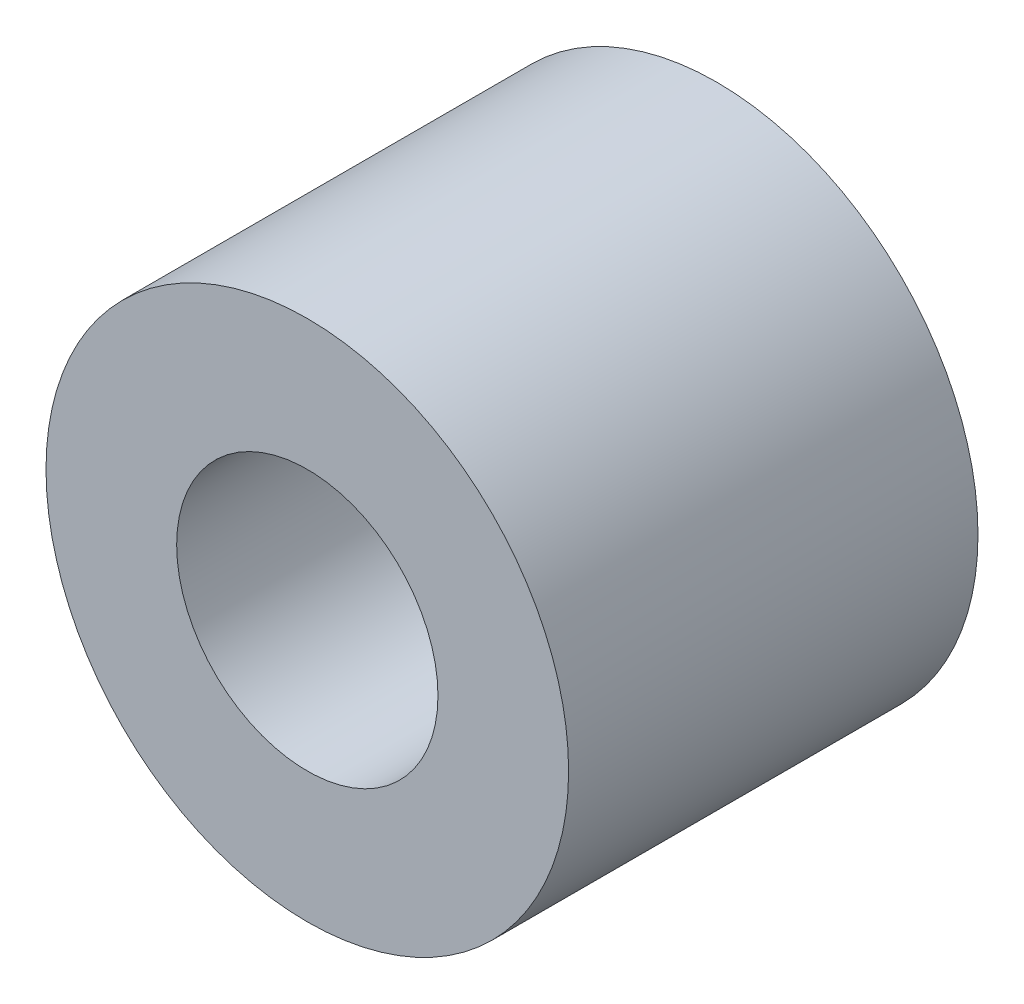
ISO-10303-21;
HEADER;
FILE_DESCRIPTION(('STEP AP214'),'2;1');
FILE_NAME('part.step','',(''),(''),'','','');
FILE_SCHEMA(('AUTOMOTIVE_DESIGN { 1 0 10303 214 1 1 1 1 }'));
ENDSEC;
DATA;
#1=APPLICATION_CONTEXT('core data for automotive mechanical design processes');
#2=APPLICATION_PROTOCOL_DEFINITION('international standard','automotive_design',2000,#1);
#3=PRODUCT_CONTEXT('',#1,'mechanical');
#4=PRODUCT('Part','Part','',(#3));
#5=PRODUCT_RELATED_PRODUCT_CATEGORY('part','',(#4));
#6=PRODUCT_DEFINITION_FORMATION('','',#4);
#7=PRODUCT_DEFINITION_CONTEXT('part definition',#1,'design');
#8=PRODUCT_DEFINITION('design','',#6,#7);
#9=PRODUCT_DEFINITION_SHAPE('','',#8);
#10=(LENGTH_UNIT() NAMED_UNIT(*) SI_UNIT(.MILLI.,.METRE.));
#11=(NAMED_UNIT(*) PLANE_ANGLE_UNIT() SI_UNIT($,.RADIAN.));
#12=(NAMED_UNIT(*) SI_UNIT($,.STERADIAN.) SOLID_ANGLE_UNIT());
#13=UNCERTAINTY_MEASURE_WITH_UNIT(LENGTH_MEASURE(1.E-05),#10,'distance_accuracy_value','');
#14=(GEOMETRIC_REPRESENTATION_CONTEXT(3) GLOBAL_UNCERTAINTY_ASSIGNED_CONTEXT((#13)) GLOBAL_UNIT_ASSIGNED_CONTEXT((#10,
#11,#12)) REPRESENTATION_CONTEXT('',''));
#15=CARTESIAN_POINT('',(0.,0.,0.));
#16=DIRECTION('',(0.,0.,1.));
#17=DIRECTION('',(1.,0.,0.));
#18=AXIS2_PLACEMENT_3D('',#15,#16,#17);
#19=CARTESIAN_POINT('',(-46.,0.,-13.1852813742386));
#20=DIRECTION('',(0.,0.,1.));
#21=DIRECTION('',(1.,0.,0.));
#22=AXIS2_PLACEMENT_3D('',#19,#20,#21);
#23=CYLINDRICAL_SURFACE('',#22,3.);
#24=CARTESIAN_POINT('',(-46.,0.,-4.7));
#25=DIRECTION('',(0.,0.,1.));
#26=DIRECTION('',(1.,0.,0.));
#27=AXIS2_PLACEMENT_3D('',#24,#25,#26);
#28=CIRCLE('',#27,3.);
#29=CARTESIAN_POINT('',(-43.,0.,-4.7));
#30=VERTEX_POINT('',#29);
#31=EDGE_CURVE('E10',#30,#30,#28,.F.);
#32=CARTESIAN_POINT('',(-46.,0.,0.));
#33=DIRECTION('',(0.,0.,1.));
#34=DIRECTION('',(1.,0.,0.));
#35=AXIS2_PLACEMENT_3D('',#32,#33,#34);
#36=CIRCLE('',#35,3.);
#37=CARTESIAN_POINT('',(-43.,0.,0.));
#38=VERTEX_POINT('',#37);
#39=EDGE_CURVE('E46',#38,#38,#36,.T.);
#40=CARTESIAN_POINT('',(-43.,0.,-4.7));
#41=CARTESIAN_POINT('',(-43.,0.,-4.65104166666667));
#42=CARTESIAN_POINT('',(-43.,0.,-4.60208333333333));
#43=CARTESIAN_POINT('',(-43.,0.,-4.50416666666667));
#44=CARTESIAN_POINT('',(-43.,0.,-4.45520833333333));
#45=CARTESIAN_POINT('',(-43.,0.,-4.35729166666667));
#46=CARTESIAN_POINT('',(-43.,0.,-4.30833333333333));
#47=CARTESIAN_POINT('',(-43.,0.,-4.21041666666667));
#48=CARTESIAN_POINT('',(-43.,0.,-4.16145833333333));
#49=CARTESIAN_POINT('',(-43.,0.,-4.06354166666667));
#50=CARTESIAN_POINT('',(-43.,0.,-4.01458333333333));
#51=CARTESIAN_POINT('',(-43.,0.,-3.91666666666667));
#52=CARTESIAN_POINT('',(-43.,0.,-3.86770833333333));
#53=CARTESIAN_POINT('',(-43.,0.,-3.76979166666667));
#54=CARTESIAN_POINT('',(-43.,0.,-3.72083333333333));
#55=CARTESIAN_POINT('',(-43.,0.,-3.62291666666667));
#56=CARTESIAN_POINT('',(-43.,0.,-3.57395833333334));
#57=CARTESIAN_POINT('',(-43.,0.,-3.47604166666667));
#58=CARTESIAN_POINT('',(-43.,0.,-3.42708333333333));
#59=CARTESIAN_POINT('',(-43.,0.,-3.32916666666667));
#60=CARTESIAN_POINT('',(-43.,0.,-3.28020833333333));
#61=CARTESIAN_POINT('',(-43.,0.,-3.18229166666667));
#62=CARTESIAN_POINT('',(-43.,0.,-3.13333333333334));
#63=CARTESIAN_POINT('',(-43.,0.,-3.03541666666667));
#64=CARTESIAN_POINT('',(-43.,0.,-2.98645833333333));
#65=CARTESIAN_POINT('',(-43.,0.,-2.88854166666667));
#66=CARTESIAN_POINT('',(-43.,0.,-2.83958333333333));
#67=CARTESIAN_POINT('',(-43.,0.,-2.74166666666667));
#68=CARTESIAN_POINT('',(-43.,0.,-2.69270833333334));
#69=CARTESIAN_POINT('',(-43.,0.,-2.59479166666667));
#70=CARTESIAN_POINT('',(-43.,0.,-2.54583333333333));
#71=CARTESIAN_POINT('',(-43.,0.,-2.44791666666667));
#72=CARTESIAN_POINT('',(-43.,0.,-2.39895833333333));
#73=CARTESIAN_POINT('',(-43.,0.,-2.30104166666667));
#74=CARTESIAN_POINT('',(-43.,0.,-2.25208333333333));
#75=CARTESIAN_POINT('',(-43.,0.,-2.15416666666667));
#76=CARTESIAN_POINT('',(-43.,0.,-2.10520833333333));
#77=CARTESIAN_POINT('',(-43.,0.,-2.00729166666667));
#78=CARTESIAN_POINT('',(-43.,0.,-1.95833333333333));
#79=CARTESIAN_POINT('',(-43.,0.,-1.86041666666667));
#80=CARTESIAN_POINT('',(-43.,0.,-1.81145833333334));
#81=CARTESIAN_POINT('',(-43.,0.,-1.71354166666667));
#82=CARTESIAN_POINT('',(-43.,0.,-1.66458333333333));
#83=CARTESIAN_POINT('',(-43.,0.,-1.56666666666667));
#84=CARTESIAN_POINT('',(-43.,0.,-1.51770833333333));
#85=CARTESIAN_POINT('',(-43.,0.,-1.41979166666667));
#86=CARTESIAN_POINT('',(-43.,0.,-1.37083333333333));
#87=CARTESIAN_POINT('',(-43.,0.,-1.27291666666667));
#88=CARTESIAN_POINT('',(-43.,0.,-1.22395833333333));
#89=CARTESIAN_POINT('',(-43.,0.,-1.12604166666667));
#90=CARTESIAN_POINT('',(-43.,0.,-1.07708333333333));
#91=CARTESIAN_POINT('',(-43.,0.,-0.979166666666668));
#92=CARTESIAN_POINT('',(-43.,0.,-0.930208333333335));
#93=CARTESIAN_POINT('',(-43.,0.,-0.832291666666668));
#94=CARTESIAN_POINT('',(-43.,0.,-0.783333333333334));
#95=CARTESIAN_POINT('',(-43.,0.,-0.685416666666667));
#96=CARTESIAN_POINT('',(-43.,0.,-0.636458333333334));
#97=CARTESIAN_POINT('',(-43.,0.,-0.538541666666668));
#98=CARTESIAN_POINT('',(-43.,0.,-0.489583333333335));
#99=CARTESIAN_POINT('',(-43.,0.,-0.391666666666668));
#100=CARTESIAN_POINT('',(-43.,0.,-0.342708333333334));
#101=CARTESIAN_POINT('',(-43.,0.,-0.244791666666668));
#102=CARTESIAN_POINT('',(-43.,0.,-0.195833333333335));
#103=CARTESIAN_POINT('',(-43.,0.,-0.0979166666666692));
#104=CARTESIAN_POINT('',(-43.,0.,-0.0489583333333355));
#105=CARTESIAN_POINT('',(-43.,0.,0.));
#106=B_SPLINE_CURVE_WITH_KNOTS('',3,(#40,#41,#42,#43,#44,#45,#46,#47,#48,#49,#50,#51,#52,#53,
#54,#55,#56,#57,#58,#59,#60,#61,#62,#63,#64,#65,#66,#67,#68,#69,#70,#71,#72,#73,#74,#75,#76,#77,
#78,#79,#80,#81,#82,#83,#84,#85,#86,#87,#88,#89,#90,#91,#92,#93,#94,#95,#96,#97,#98,#99,#100,
#101,#102,#103,#104,#105),.UNSPECIFIED.,.F.,.F.,(4,2,2,2,2,2,2,2,2,2,2,2,2,2,2,2,2,2,2,2,2,2,2,
2,2,2,2,2,2,2,2,2,4),(0.,0.146874999999999,0.293750000000001,0.440625,0.587499999999999,
0.734375000000001,0.88125,1.028125,1.175,1.321875,1.46875,1.615625,1.7625,1.909375,2.05625,
2.203125,2.35,2.496875,2.64375,2.790625,2.9375,3.084375,3.23125,3.378125,3.525,3.671875,3.81875,
3.965625,4.1125,4.259375,4.40625,4.553125,4.7),.UNSPECIFIED.);
#107=EDGE_CURVE('BSEAM35',#30,#38,#106,.T.);
#108=ORIENTED_EDGE('',*,*,#31,.F.);
#109=ORIENTED_EDGE('',*,*,#39,.F.);
#110=ORIENTED_EDGE('',*,*,#107,.T.);
#111=ORIENTED_EDGE('',*,*,#107,.F.);
#112=EDGE_LOOP('',(#108,#110,#109,#111));
#113=FACE_BOUND('',#112,.T.);
#114=ADVANCED_FACE('F35',(#113),#23,.T.);
#115=CARTESIAN_POINT('',(-46.,0.,0.));
#116=DIRECTION('',(0.,0.,1.));
#117=DIRECTION('',(1.,0.,0.));
#118=AXIS2_PLACEMENT_3D('',#115,#116,#117);
#119=PLANE('',#118);
#120=CARTESIAN_POINT('',(-46.,0.,0.));
#121=DIRECTION('',(0.,0.,1.));
#122=DIRECTION('',(1.,0.,0.));
#123=AXIS2_PLACEMENT_3D('',#120,#121,#122);
#124=CIRCLE('',#123,1.5);
#125=CARTESIAN_POINT('',(-44.5,0.,0.));
#126=VERTEX_POINT('',#125);
#127=EDGE_CURVE('E48',#126,#126,#124,.T.);
#128=ORIENTED_EDGE('',*,*,#127,.F.);
#129=EDGE_LOOP('',(#128));
#130=FACE_BOUND('',#129,.T.);
#131=ORIENTED_EDGE('',*,*,#39,.T.);
#132=EDGE_LOOP('',(#131));
#133=FACE_BOUND('',#132,.T.);
#134=ADVANCED_FACE('F53',(#130,#133),#119,.T.);
#135=CARTESIAN_POINT('',(-46.,0.,-13.1852813742386));
#136=DIRECTION('',(0.,0.,1.));
#137=DIRECTION('',(1.,0.,0.));
#138=AXIS2_PLACEMENT_3D('',#135,#136,#137);
#139=CYLINDRICAL_SURFACE('',#138,1.5);
#140=CARTESIAN_POINT('',(-46.,0.,-4.7));
#141=DIRECTION('',(0.,0.,1.));
#142=DIRECTION('',(1.,0.,0.));
#143=AXIS2_PLACEMENT_3D('',#140,#141,#142);
#144=CIRCLE('',#143,1.5);
#145=CARTESIAN_POINT('',(-44.5,0.,-4.7));
#146=VERTEX_POINT('',#145);
#147=EDGE_CURVE('E38',#146,#146,#144,.F.);
#148=CARTESIAN_POINT('',(-44.5,0.,-4.7));
#149=CARTESIAN_POINT('',(-44.5,0.,-4.65104166666667));
#150=CARTESIAN_POINT('',(-44.5,0.,-4.60208333333333));
#151=CARTESIAN_POINT('',(-44.5,0.,-4.50416666666667));
#152=CARTESIAN_POINT('',(-44.5,0.,-4.45520833333333));
#153=CARTESIAN_POINT('',(-44.5,0.,-4.35729166666667));
#154=CARTESIAN_POINT('',(-44.5,0.,-4.30833333333333));
#155=CARTESIAN_POINT('',(-44.5,0.,-4.21041666666667));
#156=CARTESIAN_POINT('',(-44.5,0.,-4.16145833333333));
#157=CARTESIAN_POINT('',(-44.5,0.,-4.06354166666667));
#158=CARTESIAN_POINT('',(-44.5,0.,-4.01458333333333));
#159=CARTESIAN_POINT('',(-44.5,0.,-3.91666666666667));
#160=CARTESIAN_POINT('',(-44.5,0.,-3.86770833333333));
#161=CARTESIAN_POINT('',(-44.5,0.,-3.76979166666667));
#162=CARTESIAN_POINT('',(-44.5,0.,-3.72083333333333));
#163=CARTESIAN_POINT('',(-44.5,0.,-3.62291666666667));
#164=CARTESIAN_POINT('',(-44.5,0.,-3.57395833333334));
#165=CARTESIAN_POINT('',(-44.5,0.,-3.47604166666667));
#166=CARTESIAN_POINT('',(-44.5,0.,-3.42708333333333));
#167=CARTESIAN_POINT('',(-44.5,0.,-3.32916666666667));
#168=CARTESIAN_POINT('',(-44.5,0.,-3.28020833333333));
#169=CARTESIAN_POINT('',(-44.5,0.,-3.18229166666667));
#170=CARTESIAN_POINT('',(-44.5,0.,-3.13333333333334));
#171=CARTESIAN_POINT('',(-44.5,0.,-3.03541666666667));
#172=CARTESIAN_POINT('',(-44.5,0.,-2.98645833333333));
#173=CARTESIAN_POINT('',(-44.5,0.,-2.88854166666667));
#174=CARTESIAN_POINT('',(-44.5,0.,-2.83958333333333));
#175=CARTESIAN_POINT('',(-44.5,0.,-2.74166666666667));
#176=CARTESIAN_POINT('',(-44.5,0.,-2.69270833333334));
#177=CARTESIAN_POINT('',(-44.5,0.,-2.59479166666667));
#178=CARTESIAN_POINT('',(-44.5,0.,-2.54583333333333));
#179=CARTESIAN_POINT('',(-44.5,0.,-2.44791666666667));
#180=CARTESIAN_POINT('',(-44.5,0.,-2.39895833333333));
#181=CARTESIAN_POINT('',(-44.5,0.,-2.30104166666667));
#182=CARTESIAN_POINT('',(-44.5,0.,-2.25208333333333));
#183=CARTESIAN_POINT('',(-44.5,0.,-2.15416666666667));
#184=CARTESIAN_POINT('',(-44.5,0.,-2.10520833333333));
#185=CARTESIAN_POINT('',(-44.5,0.,-2.00729166666667));
#186=CARTESIAN_POINT('',(-44.5,0.,-1.95833333333333));
#187=CARTESIAN_POINT('',(-44.5,0.,-1.86041666666667));
#188=CARTESIAN_POINT('',(-44.5,0.,-1.81145833333334));
#189=CARTESIAN_POINT('',(-44.5,0.,-1.71354166666667));
#190=CARTESIAN_POINT('',(-44.5,0.,-1.66458333333333));
#191=CARTESIAN_POINT('',(-44.5,0.,-1.56666666666667));
#192=CARTESIAN_POINT('',(-44.5,0.,-1.51770833333333));
#193=CARTESIAN_POINT('',(-44.5,0.,-1.41979166666667));
#194=CARTESIAN_POINT('',(-44.5,0.,-1.37083333333333));
#195=CARTESIAN_POINT('',(-44.5,0.,-1.27291666666667));
#196=CARTESIAN_POINT('',(-44.5,0.,-1.22395833333333));
#197=CARTESIAN_POINT('',(-44.5,0.,-1.12604166666667));
#198=CARTESIAN_POINT('',(-44.5,0.,-1.07708333333333));
#199=CARTESIAN_POINT('',(-44.5,0.,-0.979166666666668));
#200=CARTESIAN_POINT('',(-44.5,0.,-0.930208333333335));
#201=CARTESIAN_POINT('',(-44.5,0.,-0.832291666666668));
#202=CARTESIAN_POINT('',(-44.5,0.,-0.783333333333334));
#203=CARTESIAN_POINT('',(-44.5,0.,-0.685416666666667));
#204=CARTESIAN_POINT('',(-44.5,0.,-0.636458333333334));
#205=CARTESIAN_POINT('',(-44.5,0.,-0.538541666666668));
#206=CARTESIAN_POINT('',(-44.5,0.,-0.489583333333335));
#207=CARTESIAN_POINT('',(-44.5,0.,-0.391666666666668));
#208=CARTESIAN_POINT('',(-44.5,0.,-0.342708333333334));
#209=CARTESIAN_POINT('',(-44.5,0.,-0.244791666666668));
#210=CARTESIAN_POINT('',(-44.5,0.,-0.195833333333335));
#211=CARTESIAN_POINT('',(-44.5,0.,-0.0979166666666692));
#212=CARTESIAN_POINT('',(-44.5,0.,-0.0489583333333355));
#213=CARTESIAN_POINT('',(-44.5,0.,0.));
#214=B_SPLINE_CURVE_WITH_KNOTS('',3,(#148,#149,#150,#151,#152,#153,#154,#155,#156,#157,#158,
#159,#160,#161,#162,#163,#164,#165,#166,#167,#168,#169,#170,#171,#172,#173,#174,#175,#176,#177,
#178,#179,#180,#181,#182,#183,#184,#185,#186,#187,#188,#189,#190,#191,#192,#193,#194,#195,#196,
#197,#198,#199,#200,#201,#202,#203,#204,#205,#206,#207,#208,#209,#210,#211,#212,#213),
.UNSPECIFIED.,.F.,.F.,(4,2,2,2,2,2,2,2,2,2,2,2,2,2,2,2,2,2,2,2,2,2,2,2,2,2,2,2,2,2,2,2,4),(0.,
0.146874999999999,0.293750000000001,0.440625,0.587499999999999,0.734375000000001,0.88125,
1.028125,1.175,1.321875,1.46875,1.615625,1.7625,1.909375,2.05625,2.203125,2.35,2.496875,2.64375,
2.790625,2.9375,3.084375,3.23125,3.378125,3.525,3.671875,3.81875,3.965625,4.1125,4.259375,
4.40625,4.553125,4.7),.UNSPECIFIED.);
#215=EDGE_CURVE('BSEAM60',#146,#126,#214,.T.);
#216=ORIENTED_EDGE('',*,*,#147,.T.);
#217=ORIENTED_EDGE('',*,*,#127,.T.);
#218=ORIENTED_EDGE('',*,*,#215,.T.);
#219=ORIENTED_EDGE('',*,*,#215,.F.);
#220=EDGE_LOOP('',(#216,#218,#217,#219));
#221=FACE_BOUND('',#220,.T.);
#222=ADVANCED_FACE('F60',(#221),#139,.F.);
#223=CARTESIAN_POINT('',(0.,7.5,-4.7));
#224=DIRECTION('',(0.,0.,1.));
#225=DIRECTION('',(0.,-1.,0.));
#226=AXIS2_PLACEMENT_3D('',#223,#224,#225);
#227=PLANE('',#226);
#228=ORIENTED_EDGE('',*,*,#31,.T.);
#229=EDGE_LOOP('',(#228));
#230=FACE_BOUND('',#229,.T.);
#231=ORIENTED_EDGE('',*,*,#147,.F.);
#232=EDGE_LOOP('',(#231));
#233=FACE_BOUND('',#232,.T.);
#234=ADVANCED_FACE('F65',(#230,#233),#227,.F.);
#235=CLOSED_SHELL('',(#114,#134,#222,#234));
#236=MANIFOLD_SOLID_BREP('B2',#235);
#237=ADVANCED_BREP_SHAPE_REPRESENTATION('',(#18,#236),#14);
#238=SHAPE_DEFINITION_REPRESENTATION(#9,#237);
ENDSEC;
END-ISO-10303-21;
